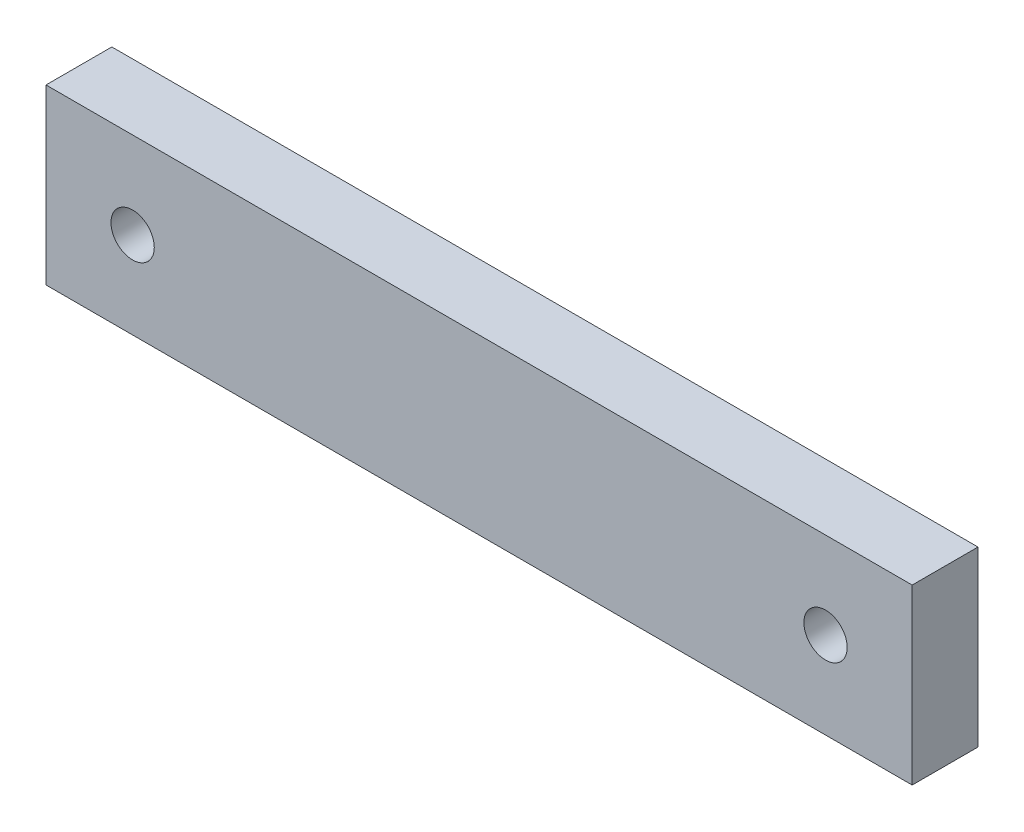
ISO-10303-21;
HEADER;
FILE_DESCRIPTION(('STEP AP214'),'2;1');
FILE_NAME('part.step','',(''),(''),'','','');
FILE_SCHEMA(('AUTOMOTIVE_DESIGN { 1 0 10303 214 1 1 1 1 }'));
ENDSEC;
DATA;
#1=APPLICATION_CONTEXT('core data for automotive mechanical design processes');
#2=APPLICATION_PROTOCOL_DEFINITION('international standard','automotive_design',2000,#1);
#3=PRODUCT_CONTEXT('',#1,'mechanical');
#4=PRODUCT('Part','Part','',(#3));
#5=PRODUCT_RELATED_PRODUCT_CATEGORY('part','',(#4));
#6=PRODUCT_DEFINITION_FORMATION('','',#4);
#7=PRODUCT_DEFINITION_CONTEXT('part definition',#1,'design');
#8=PRODUCT_DEFINITION('design','',#6,#7);
#9=PRODUCT_DEFINITION_SHAPE('','',#8);
#10=(LENGTH_UNIT() NAMED_UNIT(*) SI_UNIT(.MILLI.,.METRE.));
#11=(NAMED_UNIT(*) PLANE_ANGLE_UNIT() SI_UNIT($,.RADIAN.));
#12=(NAMED_UNIT(*) SI_UNIT($,.STERADIAN.) SOLID_ANGLE_UNIT());
#13=UNCERTAINTY_MEASURE_WITH_UNIT(LENGTH_MEASURE(1.E-05),#10,'distance_accuracy_value','');
#14=(GEOMETRIC_REPRESENTATION_CONTEXT(3) GLOBAL_UNCERTAINTY_ASSIGNED_CONTEXT((#13)) GLOBAL_UNIT_ASSIGNED_CONTEXT((#10,
#11,#12)) REPRESENTATION_CONTEXT('',''));
#15=CARTESIAN_POINT('',(0.,0.,0.));
#16=DIRECTION('',(0.,0.,1.));
#17=DIRECTION('',(1.,0.,0.));
#18=AXIS2_PLACEMENT_3D('',#15,#16,#17);
#19=CARTESIAN_POINT('',(-199.,374.,3.8));
#20=DIRECTION('',(0.,0.,1.));
#21=DIRECTION('',(1.,0.,0.));
#22=AXIS2_PLACEMENT_3D('',#19,#20,#21);
#23=CYLINDRICAL_SURFACE('',#22,1.25);
#24=CARTESIAN_POINT('',(-199.,374.,0.));
#25=DIRECTION('',(0.,0.,1.));
#26=DIRECTION('',(1.,0.,0.));
#27=AXIS2_PLACEMENT_3D('',#24,#25,#26);
#28=CIRCLE('',#27,1.25);
#29=CARTESIAN_POINT('',(-197.75,374.,0.));
#30=VERTEX_POINT('',#29);
#31=EDGE_CURVE('E46',#30,#30,#28,.F.);
#32=ORIENTED_EDGE('',*,*,#31,.T.);
#33=EDGE_LOOP('',(#32));
#34=FACE_BOUND('',#33,.T.);
#35=CARTESIAN_POINT('',(-199.,374.,3.8));
#36=DIRECTION('',(0.,0.,1.));
#37=DIRECTION('',(1.,0.,0.));
#38=AXIS2_PLACEMENT_3D('',#35,#36,#37);
#39=CIRCLE('',#38,1.25);
#40=CARTESIAN_POINT('',(-197.75,374.,3.8));
#41=VERTEX_POINT('',#40);
#42=EDGE_CURVE('E95',#41,#41,#39,.F.);
#43=ORIENTED_EDGE('',*,*,#42,.F.);
#44=EDGE_LOOP('',(#43));
#45=FACE_BOUND('',#44,.T.);
#46=ADVANCED_FACE('F42',(#34,#45),#23,.F.);
#47=CARTESIAN_POINT('',(-239.,374.,3.8));
#48=DIRECTION('',(0.,0.,1.));
#49=DIRECTION('',(1.,0.,0.));
#50=AXIS2_PLACEMENT_3D('',#47,#48,#49);
#51=CYLINDRICAL_SURFACE('',#50,1.25);
#52=CARTESIAN_POINT('',(-239.,374.,0.));
#53=DIRECTION('',(0.,0.,1.));
#54=DIRECTION('',(1.,0.,0.));
#55=AXIS2_PLACEMENT_3D('',#52,#53,#54);
#56=CIRCLE('',#55,1.25);
#57=CARTESIAN_POINT('',(-237.75,374.,0.));
#58=VERTEX_POINT('',#57);
#59=EDGE_CURVE('E121',#58,#58,#56,.F.);
#60=ORIENTED_EDGE('',*,*,#59,.T.);
#61=EDGE_LOOP('',(#60));
#62=FACE_BOUND('',#61,.T.);
#63=CARTESIAN_POINT('',(-239.,374.,3.8));
#64=DIRECTION('',(0.,0.,1.));
#65=DIRECTION('',(1.,0.,0.));
#66=AXIS2_PLACEMENT_3D('',#63,#64,#65);
#67=CIRCLE('',#66,1.25);
#68=CARTESIAN_POINT('',(-237.75,374.,3.8));
#69=VERTEX_POINT('',#68);
#70=EDGE_CURVE('E123',#69,#69,#67,.F.);
#71=ORIENTED_EDGE('',*,*,#70,.F.);
#72=EDGE_LOOP('',(#71));
#73=FACE_BOUND('',#72,.T.);
#74=ADVANCED_FACE('F141',(#62,#73),#51,.F.);
#75=CARTESIAN_POINT('',(0.,0.,3.8));
#76=DIRECTION('',(0.,0.,1.));
#77=DIRECTION('',(1.,0.,0.));
#78=AXIS2_PLACEMENT_3D('',#75,#76,#77);
#79=PLANE('',#78);
#80=ORIENTED_EDGE('',*,*,#70,.T.);
#81=EDGE_LOOP('',(#80));
#82=FACE_BOUND('',#81,.T.);
#83=ORIENTED_EDGE('',*,*,#42,.T.);
#84=EDGE_LOOP('',(#83));
#85=FACE_BOUND('',#84,.T.);
#86=DIRECTION('',(0.,1.,0.));
#87=VECTOR('',#86,1.);
#88=CARTESIAN_POINT('',(-244.,379.,3.8));
#89=LINE('',#88,#87);
#90=CARTESIAN_POINT('',(-244.,379.,3.8));
#91=VERTEX_POINT('',#90);
#92=CARTESIAN_POINT('',(-244.,369.,3.8));
#93=VERTEX_POINT('',#92);
#94=EDGE_CURVE('E89',#91,#93,#89,.F.);
#95=ORIENTED_EDGE('',*,*,#94,.T.);
#96=DIRECTION('',(1.,0.,0.));
#97=VECTOR('',#96,1.);
#98=CARTESIAN_POINT('',(-244.,369.,3.8));
#99=LINE('',#98,#97);
#100=CARTESIAN_POINT('',(-194.,369.,3.8));
#101=VERTEX_POINT('',#100);
#102=EDGE_CURVE('E86',#93,#101,#99,.T.);
#103=ORIENTED_EDGE('',*,*,#102,.T.);
#104=DIRECTION('',(0.,-1.,0.));
#105=VECTOR('',#104,1.);
#106=CARTESIAN_POINT('',(-194.,379.,3.8));
#107=LINE('',#106,#105);
#108=CARTESIAN_POINT('',(-194.,379.,3.8));
#109=VERTEX_POINT('',#108);
#110=EDGE_CURVE('E105',#101,#109,#107,.F.);
#111=ORIENTED_EDGE('',*,*,#110,.T.);
#112=DIRECTION('',(1.,0.,0.));
#113=VECTOR('',#112,1.);
#114=CARTESIAN_POINT('',(-244.,379.,3.8));
#115=LINE('',#114,#113);
#116=EDGE_CURVE('E92',#109,#91,#115,.F.);
#117=ORIENTED_EDGE('',*,*,#116,.T.);
#118=EDGE_LOOP('',(#95,#103,#111,#117));
#119=FACE_BOUND('',#118,.T.);
#120=ADVANCED_FACE('F90',(#82,#85,#119),#79,.T.);
#121=CARTESIAN_POINT('',(-244.,369.,3.8));
#122=DIRECTION('',(0.,1.,0.));
#123=DIRECTION('',(0.,0.,1.));
#124=AXIS2_PLACEMENT_3D('',#121,#122,#123);
#125=PLANE('',#124);
#126=DIRECTION('',(-1.,0.,0.));
#127=VECTOR('',#126,1.);
#128=CARTESIAN_POINT('',(369.,369.,0.));
#129=LINE('',#128,#127);
#130=CARTESIAN_POINT('',(-244.,369.,0.));
#131=VERTEX_POINT('',#130);
#132=CARTESIAN_POINT('',(-194.,369.,0.));
#133=VERTEX_POINT('',#132);
#134=EDGE_CURVE('E114',#131,#133,#129,.F.);
#135=ORIENTED_EDGE('',*,*,#134,.T.);
#136=DIRECTION('',(0.,0.,1.));
#137=VECTOR('',#136,1.);
#138=CARTESIAN_POINT('',(-194.,369.,3.8));
#139=LINE('',#138,#137);
#140=EDGE_CURVE('E104',#101,#133,#139,.F.);
#141=ORIENTED_EDGE('',*,*,#140,.F.);
#142=ORIENTED_EDGE('',*,*,#102,.F.);
#143=DIRECTION('',(0.,0.,1.));
#144=VECTOR('',#143,1.);
#145=CARTESIAN_POINT('',(-244.,369.,3.8));
#146=LINE('',#145,#144);
#147=EDGE_CURVE('E11',#131,#93,#146,.T.);
#148=ORIENTED_EDGE('',*,*,#147,.F.);
#149=EDGE_LOOP('',(#135,#141,#142,#148));
#150=FACE_BOUND('',#149,.T.);
#151=ADVANCED_FACE('F102',(#150),#125,.F.);
#152=CARTESIAN_POINT('',(-194.,379.,3.8));
#153=DIRECTION('',(-1.,0.,0.));
#154=DIRECTION('',(0.,-1.,0.));
#155=AXIS2_PLACEMENT_3D('',#152,#153,#154);
#156=PLANE('',#155);
#157=DIRECTION('',(0.,1.,0.));
#158=VECTOR('',#157,1.);
#159=CARTESIAN_POINT('',(-194.,409.,0.));
#160=LINE('',#159,#158);
#161=CARTESIAN_POINT('',(-194.,379.,0.));
#162=VERTEX_POINT('',#161);
#163=EDGE_CURVE('E116',#133,#162,#160,.T.);
#164=ORIENTED_EDGE('',*,*,#163,.T.);
#165=DIRECTION('',(0.,0.,-1.));
#166=VECTOR('',#165,1.);
#167=CARTESIAN_POINT('',(-194.,379.,3.8));
#168=LINE('',#167,#166);
#169=EDGE_CURVE('E112',#162,#109,#168,.F.);
#170=ORIENTED_EDGE('',*,*,#169,.T.);
#171=ORIENTED_EDGE('',*,*,#110,.F.);
#172=ORIENTED_EDGE('',*,*,#140,.T.);
#173=EDGE_LOOP('',(#164,#170,#171,#172));
#174=FACE_BOUND('',#173,.T.);
#175=ADVANCED_FACE('F151',(#174),#156,.F.);
#176=CARTESIAN_POINT('',(-244.,379.,3.8));
#177=DIRECTION('',(0.,-1.,0.));
#178=DIRECTION('',(0.,0.,-1.));
#179=AXIS2_PLACEMENT_3D('',#176,#177,#178);
#180=PLANE('',#179);
#181=DIRECTION('',(-1.,0.,0.));
#182=VECTOR('',#181,1.);
#183=CARTESIAN_POINT('',(369.,379.,0.));
#184=LINE('',#183,#182);
#185=CARTESIAN_POINT('',(-244.,379.,0.));
#186=VERTEX_POINT('',#185);
#187=EDGE_CURVE('E111',#162,#186,#184,.T.);
#188=ORIENTED_EDGE('',*,*,#187,.T.);
#189=DIRECTION('',(0.,0.,-1.));
#190=VECTOR('',#189,1.);
#191=CARTESIAN_POINT('',(-244.,379.,3.8));
#192=LINE('',#191,#190);
#193=EDGE_CURVE('E110',#186,#91,#192,.F.);
#194=ORIENTED_EDGE('',*,*,#193,.T.);
#195=ORIENTED_EDGE('',*,*,#116,.F.);
#196=ORIENTED_EDGE('',*,*,#169,.F.);
#197=EDGE_LOOP('',(#188,#194,#195,#196));
#198=FACE_BOUND('',#197,.T.);
#199=ADVANCED_FACE('F138',(#198),#180,.F.);
#200=CARTESIAN_POINT('',(-244.,379.,3.8));
#201=DIRECTION('',(1.,0.,0.));
#202=DIRECTION('',(0.,0.,-1.));
#203=AXIS2_PLACEMENT_3D('',#200,#201,#202);
#204=PLANE('',#203);
#205=DIRECTION('',(0.,1.,0.));
#206=VECTOR('',#205,1.);
#207=CARTESIAN_POINT('',(-244.,409.,0.));
#208=LINE('',#207,#206);
#209=EDGE_CURVE('E52',#186,#131,#208,.F.);
#210=ORIENTED_EDGE('',*,*,#209,.T.);
#211=ORIENTED_EDGE('',*,*,#147,.T.);
#212=ORIENTED_EDGE('',*,*,#94,.F.);
#213=ORIENTED_EDGE('',*,*,#193,.F.);
#214=EDGE_LOOP('',(#210,#211,#212,#213));
#215=FACE_BOUND('',#214,.T.);
#216=ADVANCED_FACE('F98',(#215),#204,.F.);
#217=CARTESIAN_POINT('',(-367.4999,406.9999,0.));
#218=DIRECTION('',(0.,0.,1.));
#219=DIRECTION('',(1.,0.,0.));
#220=AXIS2_PLACEMENT_3D('',#217,#218,#219);
#221=PLANE('',#220);
#222=ORIENTED_EDGE('',*,*,#59,.F.);
#223=EDGE_LOOP('',(#222));
#224=FACE_BOUND('',#223,.T.);
#225=ORIENTED_EDGE('',*,*,#187,.F.);
#226=ORIENTED_EDGE('',*,*,#163,.F.);
#227=ORIENTED_EDGE('',*,*,#134,.F.);
#228=ORIENTED_EDGE('',*,*,#209,.F.);
#229=EDGE_LOOP('',(#225,#226,#227,#228));
#230=FACE_BOUND('',#229,.T.);
#231=ORIENTED_EDGE('',*,*,#31,.F.);
#232=EDGE_LOOP('',(#231));
#233=FACE_BOUND('',#232,.T.);
#234=ADVANCED_FACE('F44',(#224,#230,#233),#221,.F.);
#235=CLOSED_SHELL('',(#46,#74,#120,#151,#175,#199,#216,#234));
#236=MANIFOLD_SOLID_BREP('B2',#235);
#237=ADVANCED_BREP_SHAPE_REPRESENTATION('',(#18,#236),#14);
#238=SHAPE_DEFINITION_REPRESENTATION(#9,#237);
ENDSEC;
END-ISO-10303-21;
